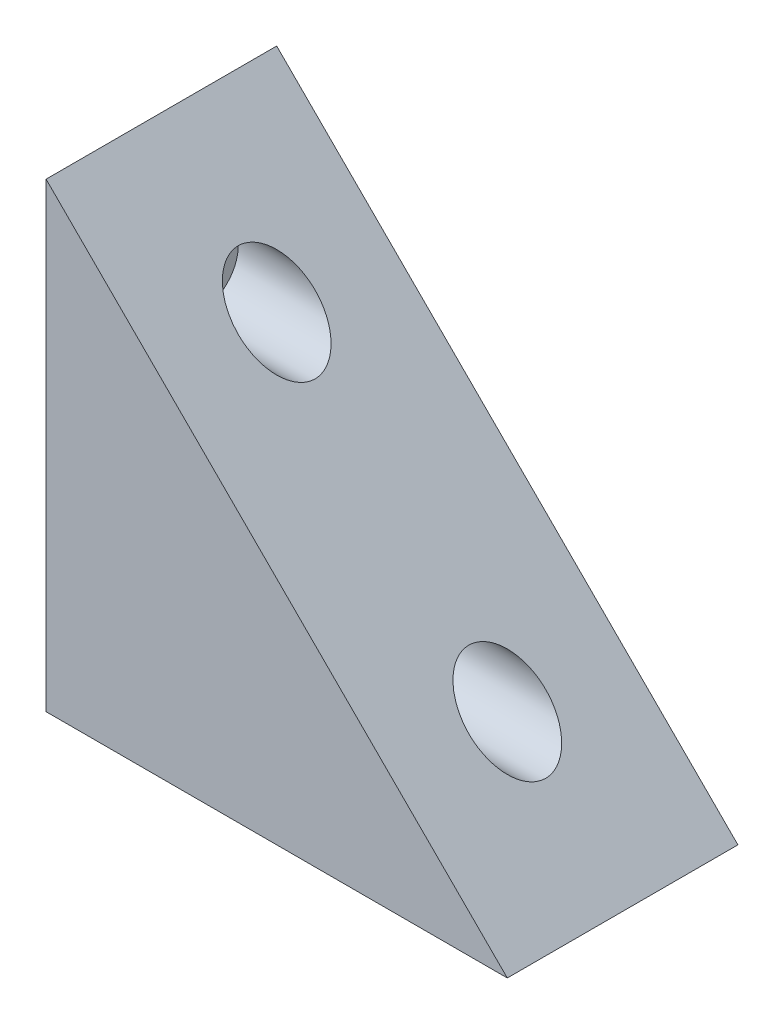
ISO-10303-21;
HEADER;
FILE_DESCRIPTION(('STEP AP214'),'2;1');
FILE_NAME('part.step','',(''),(''),'','','');
FILE_SCHEMA(('AUTOMOTIVE_DESIGN { 1 0 10303 214 1 1 1 1 }'));
ENDSEC;
DATA;
#1=APPLICATION_CONTEXT('core data for automotive mechanical design processes');
#2=APPLICATION_PROTOCOL_DEFINITION('international standard','automotive_design',2000,#1);
#3=PRODUCT_CONTEXT('',#1,'mechanical');
#4=PRODUCT('Part','Part','',(#3));
#5=PRODUCT_RELATED_PRODUCT_CATEGORY('part','',(#4));
#6=PRODUCT_DEFINITION_FORMATION('','',#4);
#7=PRODUCT_DEFINITION_CONTEXT('part definition',#1,'design');
#8=PRODUCT_DEFINITION('design','',#6,#7);
#9=PRODUCT_DEFINITION_SHAPE('','',#8);
#10=(LENGTH_UNIT() NAMED_UNIT(*) SI_UNIT(.MILLI.,.METRE.));
#11=(NAMED_UNIT(*) PLANE_ANGLE_UNIT() SI_UNIT($,.RADIAN.));
#12=(NAMED_UNIT(*) SI_UNIT($,.STERADIAN.) SOLID_ANGLE_UNIT());
#13=UNCERTAINTY_MEASURE_WITH_UNIT(LENGTH_MEASURE(1.E-05),#10,'distance_accuracy_value','');
#14=(GEOMETRIC_REPRESENTATION_CONTEXT(3) GLOBAL_UNCERTAINTY_ASSIGNED_CONTEXT((#13)) GLOBAL_UNIT_ASSIGNED_CONTEXT((#10,
#11,#12)) REPRESENTATION_CONTEXT('',''));
#15=CARTESIAN_POINT('',(0.,0.,0.));
#16=DIRECTION('',(0.,0.,1.));
#17=DIRECTION('',(1.,0.,0.));
#18=AXIS2_PLACEMENT_3D('',#15,#16,#17);
#19=CARTESIAN_POINT('',(60.,0.,30.));
#20=DIRECTION('',(0.,1.,0.));
#21=DIRECTION('',(-1.,0.,0.));
#22=AXIS2_PLACEMENT_3D('',#19,#20,#21);
#23=PLANE('',#22);
#24=DIRECTION('',(1.,0.,0.));
#25=VECTOR('',#24,1.);
#26=CARTESIAN_POINT('',(60.,0.,0.));
#27=LINE('',#26,#25);
#28=CARTESIAN_POINT('',(0.,0.,0.));
#29=VERTEX_POINT('',#28);
#30=CARTESIAN_POINT('',(60.,0.,0.));
#31=VERTEX_POINT('',#30);
#32=EDGE_CURVE('E95',#29,#31,#27,.T.);
#33=ORIENTED_EDGE('',*,*,#32,.T.);
#34=DIRECTION('',(0.,0.,-1.));
#35=VECTOR('',#34,1.);
#36=CARTESIAN_POINT('',(60.,0.,30.));
#37=LINE('',#36,#35);
#38=CARTESIAN_POINT('',(60.,0.,30.));
#39=VERTEX_POINT('',#38);
#40=EDGE_CURVE('E11',#39,#31,#37,.T.);
#41=ORIENTED_EDGE('',*,*,#40,.F.);
#42=DIRECTION('',(1.,0.,0.));
#43=VECTOR('',#42,1.);
#44=CARTESIAN_POINT('',(60.,0.,30.));
#45=LINE('',#44,#43);
#46=CARTESIAN_POINT('',(0.,0.,30.));
#47=VERTEX_POINT('',#46);
#48=EDGE_CURVE('E87',#47,#39,#45,.T.);
#49=ORIENTED_EDGE('',*,*,#48,.F.);
#50=DIRECTION('',(0.,0.,-1.));
#51=VECTOR('',#50,1.);
#52=CARTESIAN_POINT('',(0.,0.,30.));
#53=LINE('',#52,#51);
#54=EDGE_CURVE('E96',#47,#29,#53,.T.);
#55=ORIENTED_EDGE('',*,*,#54,.T.);
#56=EDGE_LOOP('',(#33,#41,#49,#55));
#57=FACE_BOUND('',#56,.T.);
#58=ADVANCED_FACE('F43',(#57),#23,.F.);
#59=CARTESIAN_POINT('',(0.,60.,30.));
#60=DIRECTION('',(-0.707106781186547,-0.707106781186548,0.));
#61=DIRECTION('',(0.707106781186548,-0.707106781186547,0.));
#62=AXIS2_PLACEMENT_3D('',#59,#60,#61);
#63=PLANE('',#62);
#64=CARTESIAN_POINT('',(45.,15.,15.));
#65=DIRECTION('',(-0.707106781186547,-0.707106781186548,0.));
#66=DIRECTION('',(-0.707106781186548,0.707106781186547,0.));
#67=AXIS2_PLACEMENT_3D('',#64,#65,#66);
#68=ELLIPSE('',#67,7.07106781186548,5.);
#69=CARTESIAN_POINT('',(40.,20.,15.));
#70=VERTEX_POINT('',#69);
#71=EDGE_CURVE('E46',#70,#70,#68,.T.);
#72=ORIENTED_EDGE('',*,*,#71,.T.);
#73=EDGE_LOOP('',(#72));
#74=FACE_BOUND('',#73,.T.);
#75=CARTESIAN_POINT('',(15.,45.,15.));
#76=DIRECTION('',(-0.707106781186547,-0.707106781186548,0.));
#77=DIRECTION('',(-0.707106781186548,0.707106781186547,0.));
#78=AXIS2_PLACEMENT_3D('',#75,#76,#77);
#79=ELLIPSE('',#78,7.07106781186548,5.);
#80=CARTESIAN_POINT('',(10.,50.,15.));
#81=VERTEX_POINT('',#80);
#82=EDGE_CURVE('E123',#81,#81,#79,.T.);
#83=ORIENTED_EDGE('',*,*,#82,.T.);
#84=EDGE_LOOP('',(#83));
#85=FACE_BOUND('',#84,.T.);
#86=DIRECTION('',(-0.707106781186548,0.707106781186547,0.));
#87=VECTOR('',#86,1.);
#88=CARTESIAN_POINT('',(0.,60.,0.));
#89=LINE('',#88,#87);
#90=CARTESIAN_POINT('',(0.,60.,0.));
#91=VERTEX_POINT('',#90);
#92=EDGE_CURVE('E74',#31,#91,#89,.T.);
#93=ORIENTED_EDGE('',*,*,#92,.T.);
#94=DIRECTION('',(0.,0.,-1.));
#95=VECTOR('',#94,1.);
#96=CARTESIAN_POINT('',(0.,60.,30.));
#97=LINE('',#96,#95);
#98=CARTESIAN_POINT('',(0.,60.,30.));
#99=VERTEX_POINT('',#98);
#100=EDGE_CURVE('E53',#99,#91,#97,.T.);
#101=ORIENTED_EDGE('',*,*,#100,.F.);
#102=DIRECTION('',(-0.707106781186548,0.707106781186547,0.));
#103=VECTOR('',#102,1.);
#104=CARTESIAN_POINT('',(0.,60.,30.));
#105=LINE('',#104,#103);
#106=EDGE_CURVE('E82',#39,#99,#105,.T.);
#107=ORIENTED_EDGE('',*,*,#106,.F.);
#108=ORIENTED_EDGE('',*,*,#40,.T.);
#109=EDGE_LOOP('',(#93,#101,#107,#108));
#110=FACE_BOUND('',#109,.T.);
#111=ADVANCED_FACE('F83',(#74,#85,#110),#63,.F.);
#112=CARTESIAN_POINT('',(0.,0.,30.));
#113=DIRECTION('',(1.,0.,0.));
#114=DIRECTION('',(0.,0.,-1.));
#115=AXIS2_PLACEMENT_3D('',#112,#113,#114);
#116=PLANE('',#115);
#117=CARTESIAN_POINT('',(0.,15.,15.));
#118=DIRECTION('',(-1.,0.,0.));
#119=DIRECTION('',(0.,0.,1.));
#120=AXIS2_PLACEMENT_3D('',#117,#118,#119);
#121=CIRCLE('',#120,3.);
#122=CARTESIAN_POINT('',(0.,15.,18.));
#123=VERTEX_POINT('',#122);
#124=EDGE_CURVE('E99',#123,#123,#121,.T.);
#125=ORIENTED_EDGE('',*,*,#124,.F.);
#126=EDGE_LOOP('',(#125));
#127=FACE_BOUND('',#126,.T.);
#128=CARTESIAN_POINT('',(0.,45.,15.));
#129=DIRECTION('',(-1.,0.,0.));
#130=DIRECTION('',(0.,0.,1.));
#131=AXIS2_PLACEMENT_3D('',#128,#129,#130);
#132=CIRCLE('',#131,3.);
#133=CARTESIAN_POINT('',(0.,45.,18.));
#134=VERTEX_POINT('',#133);
#135=EDGE_CURVE('E105',#134,#134,#132,.T.);
#136=ORIENTED_EDGE('',*,*,#135,.F.);
#137=EDGE_LOOP('',(#136));
#138=FACE_BOUND('',#137,.T.);
#139=DIRECTION('',(0.,-1.,0.));
#140=VECTOR('',#139,1.);
#141=CARTESIAN_POINT('',(0.,0.,0.));
#142=LINE('',#141,#140);
#143=EDGE_CURVE('E79',#91,#29,#142,.T.);
#144=ORIENTED_EDGE('',*,*,#143,.T.);
#145=ORIENTED_EDGE('',*,*,#54,.F.);
#146=DIRECTION('',(0.,-1.,0.));
#147=VECTOR('',#146,1.);
#148=CARTESIAN_POINT('',(0.,0.,30.));
#149=LINE('',#148,#147);
#150=EDGE_CURVE('E62',#99,#47,#149,.T.);
#151=ORIENTED_EDGE('',*,*,#150,.F.);
#152=ORIENTED_EDGE('',*,*,#100,.T.);
#153=EDGE_LOOP('',(#144,#145,#151,#152));
#154=FACE_BOUND('',#153,.T.);
#155=ADVANCED_FACE('F163',(#127,#138,#154),#116,.F.);
#156=CARTESIAN_POINT('',(0.,0.,30.));
#157=DIRECTION('',(0.,0.,-1.));
#158=DIRECTION('',(-1.,0.,0.));
#159=AXIS2_PLACEMENT_3D('',#156,#157,#158);
#160=PLANE('',#159);
#161=ORIENTED_EDGE('',*,*,#48,.T.);
#162=ORIENTED_EDGE('',*,*,#106,.T.);
#163=ORIENTED_EDGE('',*,*,#150,.T.);
#164=EDGE_LOOP('',(#161,#162,#163));
#165=FACE_BOUND('',#164,.T.);
#166=ADVANCED_FACE('F90',(#165),#160,.F.);
#167=CARTESIAN_POINT('',(0.,0.,0.));
#168=DIRECTION('',(0.,0.,-1.));
#169=DIRECTION('',(-1.,0.,0.));
#170=AXIS2_PLACEMENT_3D('',#167,#168,#169);
#171=PLANE('',#170);
#172=ORIENTED_EDGE('',*,*,#32,.F.);
#173=ORIENTED_EDGE('',*,*,#143,.F.);
#174=ORIENTED_EDGE('',*,*,#92,.F.);
#175=EDGE_LOOP('',(#172,#173,#174));
#176=FACE_BOUND('',#175,.T.);
#177=ADVANCED_FACE('F171',(#176),#171,.T.);
#178=CARTESIAN_POINT('',(60.,45.,15.));
#179=DIRECTION('',(-1.,0.,0.));
#180=DIRECTION('',(0.,0.,1.));
#181=AXIS2_PLACEMENT_3D('',#178,#179,#180);
#182=CYLINDRICAL_SURFACE('',#181,3.);
#183=CARTESIAN_POINT('',(5.,45.,15.));
#184=DIRECTION('',(-1.,0.,0.));
#185=DIRECTION('',(0.,0.,1.));
#186=AXIS2_PLACEMENT_3D('',#183,#184,#185);
#187=CIRCLE('',#186,3.);
#188=CARTESIAN_POINT('',(5.,45.,18.));
#189=VERTEX_POINT('',#188);
#190=EDGE_CURVE('E119',#189,#189,#187,.F.);
#191=ORIENTED_EDGE('',*,*,#190,.T.);
#192=EDGE_LOOP('',(#191));
#193=FACE_BOUND('',#192,.T.);
#194=ORIENTED_EDGE('',*,*,#135,.T.);
#195=EDGE_LOOP('',(#194));
#196=FACE_BOUND('',#195,.T.);
#197=ADVANCED_FACE('F159',(#193,#196),#182,.F.);
#198=CARTESIAN_POINT('',(60.,15.,15.));
#199=DIRECTION('',(-1.,0.,0.));
#200=DIRECTION('',(0.,0.,1.));
#201=AXIS2_PLACEMENT_3D('',#198,#199,#200);
#202=CYLINDRICAL_SURFACE('',#201,3.);
#203=CARTESIAN_POINT('',(5.,15.,15.));
#204=DIRECTION('',(-1.,0.,0.));
#205=DIRECTION('',(0.,0.,1.));
#206=AXIS2_PLACEMENT_3D('',#203,#204,#205);
#207=CIRCLE('',#206,3.);
#208=CARTESIAN_POINT('',(5.,15.,18.));
#209=VERTEX_POINT('',#208);
#210=EDGE_CURVE('E115',#209,#209,#207,.F.);
#211=ORIENTED_EDGE('',*,*,#210,.T.);
#212=EDGE_LOOP('',(#211));
#213=FACE_BOUND('',#212,.T.);
#214=ORIENTED_EDGE('',*,*,#124,.T.);
#215=EDGE_LOOP('',(#214));
#216=FACE_BOUND('',#215,.T.);
#217=ADVANCED_FACE('F156',(#213,#216),#202,.F.);
#218=CARTESIAN_POINT('',(65.,15.,15.));
#219=DIRECTION('',(-1.,0.,0.));
#220=DIRECTION('',(0.,0.,1.));
#221=AXIS2_PLACEMENT_3D('',#218,#219,#220);
#222=CYLINDRICAL_SURFACE('',#221,5.);
#223=CARTESIAN_POINT('',(5.,15.,15.));
#224=DIRECTION('',(-1.,0.,0.));
#225=DIRECTION('',(0.,0.,1.));
#226=AXIS2_PLACEMENT_3D('',#223,#224,#225);
#227=CIRCLE('',#226,5.);
#228=CARTESIAN_POINT('',(5.,15.,20.));
#229=VERTEX_POINT('',#228);
#230=EDGE_CURVE('E120',#229,#229,#227,.T.);
#231=ORIENTED_EDGE('',*,*,#230,.T.);
#232=EDGE_LOOP('',(#231));
#233=FACE_BOUND('',#232,.T.);
#234=ORIENTED_EDGE('',*,*,#71,.F.);
#235=EDGE_LOOP('',(#234));
#236=FACE_BOUND('',#235,.T.);
#237=ADVANCED_FACE('F146',(#233,#236),#222,.F.);
#238=CARTESIAN_POINT('',(5.,15.,15.));
#239=DIRECTION('',(-1.,0.,0.));
#240=DIRECTION('',(0.,0.,1.));
#241=AXIS2_PLACEMENT_3D('',#238,#239,#240);
#242=PLANE('',#241);
#243=ORIENTED_EDGE('',*,*,#230,.F.);
#244=EDGE_LOOP('',(#243));
#245=FACE_BOUND('',#244,.T.);
#246=ORIENTED_EDGE('',*,*,#210,.F.);
#247=EDGE_LOOP('',(#246));
#248=FACE_BOUND('',#247,.T.);
#249=ADVANCED_FACE('F149',(#245,#248),#242,.F.);
#250=CARTESIAN_POINT('',(65.,45.,15.));
#251=DIRECTION('',(-1.,0.,0.));
#252=DIRECTION('',(0.,0.,1.));
#253=AXIS2_PLACEMENT_3D('',#250,#251,#252);
#254=CYLINDRICAL_SURFACE('',#253,5.);
#255=CARTESIAN_POINT('',(5.,45.,15.));
#256=DIRECTION('',(-1.,0.,0.));
#257=DIRECTION('',(0.,0.,1.));
#258=AXIS2_PLACEMENT_3D('',#255,#256,#257);
#259=CIRCLE('',#258,5.);
#260=CARTESIAN_POINT('',(5.,45.,20.));
#261=VERTEX_POINT('',#260);
#262=EDGE_CURVE('E138',#261,#261,#259,.T.);
#263=ORIENTED_EDGE('',*,*,#262,.T.);
#264=EDGE_LOOP('',(#263));
#265=FACE_BOUND('',#264,.T.);
#266=ORIENTED_EDGE('',*,*,#82,.F.);
#267=EDGE_LOOP('',(#266));
#268=FACE_BOUND('',#267,.T.);
#269=ADVANCED_FACE('F152',(#265,#268),#254,.F.);
#270=CARTESIAN_POINT('',(5.,45.,15.));
#271=DIRECTION('',(-1.,0.,0.));
#272=DIRECTION('',(0.,0.,1.));
#273=AXIS2_PLACEMENT_3D('',#270,#271,#272);
#274=PLANE('',#273);
#275=ORIENTED_EDGE('',*,*,#262,.F.);
#276=EDGE_LOOP('',(#275));
#277=FACE_BOUND('',#276,.T.);
#278=ORIENTED_EDGE('',*,*,#190,.F.);
#279=EDGE_LOOP('',(#278));
#280=FACE_BOUND('',#279,.T.);
#281=ADVANCED_FACE('F230',(#277,#280),#274,.F.);
#282=CLOSED_SHELL('',(#58,#111,#155,#166,#177,#197,#217,#237,#249,#269,#281));
#283=MANIFOLD_SOLID_BREP('B2',#282);
#284=ADVANCED_BREP_SHAPE_REPRESENTATION('',(#18,#283),#14);
#285=SHAPE_DEFINITION_REPRESENTATION(#9,#284);
ENDSEC;
END-ISO-10303-21;
